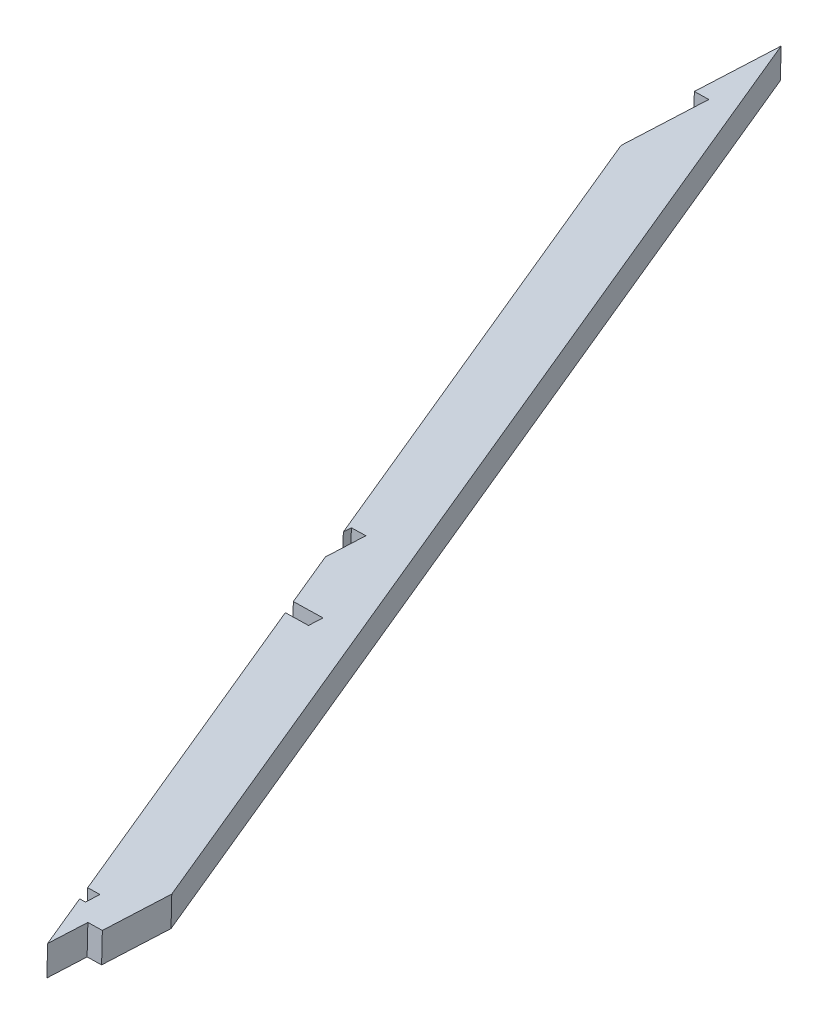
ISO-10303-21;
HEADER;
FILE_DESCRIPTION(('STEP AP214'),'2;1');
FILE_NAME('part.step','',(''),(''),'','','');
FILE_SCHEMA(('AUTOMOTIVE_DESIGN { 1 0 10303 214 1 1 1 1 }'));
ENDSEC;
DATA;
#1=APPLICATION_CONTEXT('core data for automotive mechanical design processes');
#2=APPLICATION_PROTOCOL_DEFINITION('international standard','automotive_design',2000,#1);
#3=PRODUCT_CONTEXT('',#1,'mechanical');
#4=PRODUCT('Part','Part','',(#3));
#5=PRODUCT_RELATED_PRODUCT_CATEGORY('part','',(#4));
#6=PRODUCT_DEFINITION_FORMATION('','',#4);
#7=PRODUCT_DEFINITION_CONTEXT('part definition',#1,'design');
#8=PRODUCT_DEFINITION('design','',#6,#7);
#9=PRODUCT_DEFINITION_SHAPE('','',#8);
#10=(LENGTH_UNIT() NAMED_UNIT(*) SI_UNIT(.MILLI.,.METRE.));
#11=(NAMED_UNIT(*) PLANE_ANGLE_UNIT() SI_UNIT($,.RADIAN.));
#12=(NAMED_UNIT(*) SI_UNIT($,.STERADIAN.) SOLID_ANGLE_UNIT());
#13=UNCERTAINTY_MEASURE_WITH_UNIT(LENGTH_MEASURE(1.E-05),#10,'distance_accuracy_value','');
#14=(GEOMETRIC_REPRESENTATION_CONTEXT(3) GLOBAL_UNCERTAINTY_ASSIGNED_CONTEXT((#13)) GLOBAL_UNIT_ASSIGNED_CONTEXT((#10,
#11,#12)) REPRESENTATION_CONTEXT('',''));
#15=CARTESIAN_POINT('',(0.,0.,0.));
#16=DIRECTION('',(0.,0.,1.));
#17=DIRECTION('',(1.,0.,0.));
#18=AXIS2_PLACEMENT_3D('',#15,#16,#17);
#19=CARTESIAN_POINT('',(364.27297918136,60.8553078660558,343.26140953432));
#20=DIRECTION('',(-0.913176215467708,1.17576176539816E-13,0.40756496353842));
#21=DIRECTION('',(-0.40756496353842,0.,-0.913176215467708));
#22=AXIS2_PLACEMENT_3D('',#19,#20,#21);
#23=PLANE('',#22);
#24=DIRECTION('',(-0.407036793898781,-0.0508935265530076,-0.911992816510964));
#25=VECTOR('',#24,1.);
#26=CARTESIAN_POINT('',(364.141264825195,67.1970788044048,342.966294821213));
#27=LINE('',#26,#25);
#28=CARTESIAN_POINT('',(364.141264825195,67.1970788044048,342.966294821213));
#29=VERTEX_POINT('',#28);
#30=CARTESIAN_POINT('',(329.209482269948,62.8294107467072,264.699329190999));
#31=VERTEX_POINT('',#30);
#32=EDGE_CURVE('E203',#29,#31,#27,.T.);
#33=ORIENTED_EDGE('',*,*,#32,.T.);
#34=DIRECTION('',(-0.0207424182938109,0.99870408477937,-0.0464747579695286));
#35=VECTOR('',#34,1.);
#36=CARTESIAN_POINT('',(329.341196626113,56.4876398083582,264.994443904106));
#37=LINE('',#36,#35);
#38=CARTESIAN_POINT('',(329.341196626113,56.4876398083582,264.994443904106));
#39=VERTEX_POINT('',#38);
#40=EDGE_CURVE('E38',#39,#31,#37,.T.);
#41=ORIENTED_EDGE('',*,*,#40,.F.);
#42=DIRECTION('',(-0.407036793898781,-0.0508935265530076,-0.911992816510964));
#43=VECTOR('',#42,1.);
#44=CARTESIAN_POINT('',(364.27297918136,60.8553078660558,343.26140953432));
#45=LINE('',#44,#43);
#46=CARTESIAN_POINT('',(364.27297918136,60.8553078660558,343.26140953432));
#47=VERTEX_POINT('',#46);
#48=EDGE_CURVE('E240',#47,#39,#45,.T.);
#49=ORIENTED_EDGE('',*,*,#48,.F.);
#50=DIRECTION('',(-0.0207424182938109,0.99870408477937,-0.0464747579695286));
#51=VECTOR('',#50,1.);
#52=CARTESIAN_POINT('',(364.27297918136,60.8553078660558,343.26140953432));
#53=LINE('',#52,#51);
#54=EDGE_CURVE('E11',#47,#29,#53,.T.);
#55=ORIENTED_EDGE('',*,*,#54,.T.);
#56=EDGE_LOOP('',(#33,#41,#49,#55));
#57=FACE_BOUND('',#56,.T.);
#58=ADVANCED_FACE('F35',(#57),#23,.T.);
#59=CARTESIAN_POINT('',(364.27297918136,60.8553078660558,343.26140953432));
#60=DIRECTION('',(-3.75435237648223E-05,0.0464839809289175,0.998919034810872));
#61=DIRECTION('',(0.,0.998919035514868,-0.0464839809616775));
#62=AXIS2_PLACEMENT_3D('',#59,#60,#61);
#63=PLANE('',#62);
#64=DIRECTION('',(-0.999784852192615,-0.0207217412878779,0.000926695305848225));
#65=VECTOR('',#64,1.);
#66=CARTESIAN_POINT('',(364.141264825195,67.1970788044048,342.966294821213));
#67=LINE('',#66,#65);
#68=CARTESIAN_POINT('',(366.826046244413,67.2527241223565,342.963806311477));
#69=VERTEX_POINT('',#68);
#70=EDGE_CURVE('E124',#69,#29,#67,.T.);
#71=ORIENTED_EDGE('',*,*,#70,.T.);
#72=ORIENTED_EDGE('',*,*,#54,.F.);
#73=DIRECTION('',(-0.999784852192615,-0.0207217412878779,0.000926695305848225));
#74=VECTOR('',#73,1.);
#75=CARTESIAN_POINT('',(364.27297918136,60.8553078660558,343.26140953432));
#76=LINE('',#75,#74);
#77=CARTESIAN_POINT('',(366.957760600579,60.9109531840075,343.258921024584));
#78=VERTEX_POINT('',#77);
#79=EDGE_CURVE('E53',#78,#47,#76,.T.);
#80=ORIENTED_EDGE('',*,*,#79,.F.);
#81=DIRECTION('',(-0.0207424182938109,0.99870408477937,-0.0464747579695286));
#82=VECTOR('',#81,1.);
#83=CARTESIAN_POINT('',(366.957760600579,60.9109531840075,343.258921024584));
#84=LINE('',#83,#82);
#85=EDGE_CURVE('E44',#78,#69,#84,.T.);
#86=ORIENTED_EDGE('',*,*,#85,.T.);
#87=EDGE_LOOP('',(#71,#72,#80,#86));
#88=FACE_BOUND('',#87,.T.);
#89=ADVANCED_FACE('F405',(#88),#63,.T.);
#90=CARTESIAN_POINT('',(366.957760600579,60.9109531840075,343.258921024584));
#91=DIRECTION('',(-0.999784852192615,-0.0207217412878786,0.000926695305820222));
#92=DIRECTION('',(0.020721750185429,-0.999785281482606,0.));
#93=AXIS2_PLACEMENT_3D('',#90,#91,#92);
#94=PLANE('',#93);
#95=DIRECTION('',(3.75435237928782E-05,-0.0464839809289197,-0.998919034810872));
#96=VECTOR('',#95,1.);
#97=CARTESIAN_POINT('',(366.826046244413,67.2527241223565,342.963806311477));
#98=LINE('',#97,#96);
#99=CARTESIAN_POINT('',(366.825927043725,67.4003107618058,346.135374247002));
#100=VERTEX_POINT('',#99);
#101=EDGE_CURVE('E118',#100,#69,#98,.T.);
#102=ORIENTED_EDGE('',*,*,#101,.T.);
#103=ORIENTED_EDGE('',*,*,#85,.F.);
#104=DIRECTION('',(3.75435237928782E-05,-0.0464839809289197,-0.998919034810872));
#105=VECTOR('',#104,1.);
#106=CARTESIAN_POINT('',(366.957760600579,60.9109531840075,343.258921024584));
#107=LINE('',#106,#105);
#108=CARTESIAN_POINT('',(366.957641399891,61.0585398234568,346.430488960108));
#109=VERTEX_POINT('',#108);
#110=EDGE_CURVE('E185',#109,#78,#107,.T.);
#111=ORIENTED_EDGE('',*,*,#110,.F.);
#112=DIRECTION('',(-0.0207424182938109,0.99870408477937,-0.0464747579695286));
#113=VECTOR('',#112,1.);
#114=CARTESIAN_POINT('',(366.957641399891,61.0585398234568,346.430488960108));
#115=LINE('',#114,#113);
#116=EDGE_CURVE('E192',#109,#100,#115,.T.);
#117=ORIENTED_EDGE('',*,*,#116,.T.);
#118=EDGE_LOOP('',(#102,#103,#111,#117));
#119=FACE_BOUND('',#118,.T.);
#120=ADVANCED_FACE('F198',(#119),#94,.T.);
#121=CARTESIAN_POINT('',(366.957641399891,61.0585398234568,346.430488960108));
#122=DIRECTION('',(3.75435238199837E-05,-0.0464839809289164,-0.998919034810872));
#123=DIRECTION('',(0.,-0.998919035514868,0.0464839809616764));
#124=AXIS2_PLACEMENT_3D('',#121,#122,#123);
#125=PLANE('',#124);
#126=DIRECTION('',(0.999784852192615,0.0207217412878924,-0.000926695305793668));
#127=VECTOR('',#126,1.);
#128=CARTESIAN_POINT('',(366.825927043725,67.4003107618058,346.135374247002));
#129=LINE('',#128,#127);
#130=CARTESIAN_POINT('',(365.556200281441,67.3739941503702,346.13655115004));
#131=VERTEX_POINT('',#130);
#132=EDGE_CURVE('E195',#131,#100,#129,.T.);
#133=ORIENTED_EDGE('',*,*,#132,.T.);
#134=ORIENTED_EDGE('',*,*,#116,.F.);
#135=DIRECTION('',(0.999784852192615,0.0207217412878924,-0.000926695305793668));
#136=VECTOR('',#135,1.);
#137=CARTESIAN_POINT('',(366.957641399891,61.0585398234568,346.430488960108));
#138=LINE('',#137,#136);
#139=CARTESIAN_POINT('',(365.687914637606,61.0322232120212,346.431665863147));
#140=VERTEX_POINT('',#139);
#141=EDGE_CURVE('E181',#140,#109,#138,.T.);
#142=ORIENTED_EDGE('',*,*,#141,.F.);
#143=DIRECTION('',(-0.0207424182938109,0.99870408477937,-0.0464747579695286));
#144=VECTOR('',#143,1.);
#145=CARTESIAN_POINT('',(365.687914637606,61.0322232120212,346.431665863147));
#146=LINE('',#145,#144);
#147=EDGE_CURVE('E196',#140,#131,#146,.T.);
#148=ORIENTED_EDGE('',*,*,#147,.T.);
#149=EDGE_LOOP('',(#133,#134,#142,#148));
#150=FACE_BOUND('',#149,.T.);
#151=ADVANCED_FACE('F193',(#150),#125,.T.);
#152=CARTESIAN_POINT('',(371.353078166241,61.7405624943501,359.124838863521));
#153=DIRECTION('',(-0.913176215467708,1.17616727408472E-13,0.407564963538421));
#154=DIRECTION('',(-0.407564963538421,0.,-0.913176215467708));
#155=AXIS2_PLACEMENT_3D('',#152,#153,#154);
#156=PLANE('',#155);
#157=DIRECTION('',(-0.407036793898781,-0.0508935265530086,-0.911992816510963));
#158=VECTOR('',#157,1.);
#159=CARTESIAN_POINT('',(371.221363810076,68.0823334326991,358.829724150414));
#160=LINE('',#159,#158);
#161=CARTESIAN_POINT('',(371.221363810076,68.0823334326991,358.829724150414));
#162=VERTEX_POINT('',#161);
#163=EDGE_CURVE('E236',#162,#131,#160,.T.);
#164=ORIENTED_EDGE('',*,*,#163,.T.);
#165=ORIENTED_EDGE('',*,*,#147,.F.);
#166=DIRECTION('',(-0.407036793898781,-0.0508935265530086,-0.911992816510963));
#167=VECTOR('',#166,1.);
#168=CARTESIAN_POINT('',(371.353078166241,61.7405624943501,359.124838863521));
#169=LINE('',#168,#167);
#170=CARTESIAN_POINT('',(371.353078166241,61.7405624943501,359.124838863521));
#171=VERTEX_POINT('',#170);
#172=EDGE_CURVE('E187',#171,#140,#169,.T.);
#173=ORIENTED_EDGE('',*,*,#172,.F.);
#174=DIRECTION('',(-0.0207424182938109,0.99870408477937,-0.0464747579695286));
#175=VECTOR('',#174,1.);
#176=CARTESIAN_POINT('',(371.353078166241,61.7405624943501,359.124838863521));
#177=LINE('',#176,#175);
#178=EDGE_CURVE('E244',#171,#162,#177,.T.);
#179=ORIENTED_EDGE('',*,*,#178,.T.);
#180=EDGE_LOOP('',(#164,#165,#173,#179));
#181=FACE_BOUND('',#180,.T.);
#182=ADVANCED_FACE('F344',(#181),#156,.T.);
#183=CARTESIAN_POINT('',(371.353078166241,61.7405624943501,359.124838863521));
#184=DIRECTION('',(0.999784852192615,0.020721741287877,-0.000926695305854155));
#185=DIRECTION('',(-0.0207217501854274,0.999785281482605,0.));
#186=AXIS2_PLACEMENT_3D('',#183,#184,#185);
#187=PLANE('',#186);
#188=DIRECTION('',(-3.75435237588767E-05,0.0464839809289185,0.998919034810872));
#189=VECTOR('',#188,1.);
#190=CARTESIAN_POINT('',(371.221363810076,68.0823334326991,358.829724150414));
#191=LINE('',#190,#189);
#192=CARTESIAN_POINT('',(371.221695348391,67.6718439738392,350.008497442844));
#193=VERTEX_POINT('',#192);
#194=EDGE_CURVE('E234',#193,#162,#191,.T.);
#195=ORIENTED_EDGE('',*,*,#194,.T.);
#196=ORIENTED_EDGE('',*,*,#178,.F.);
#197=DIRECTION('',(-3.75435237588767E-05,0.0464839809289185,0.998919034810872));
#198=VECTOR('',#197,1.);
#199=CARTESIAN_POINT('',(371.353078166241,61.7405624943501,359.124838863521));
#200=LINE('',#199,#198);
#201=CARTESIAN_POINT('',(371.353409704557,61.3300730354902,350.30361215595));
#202=VERTEX_POINT('',#201);
#203=EDGE_CURVE('E334',#202,#171,#200,.T.);
#204=ORIENTED_EDGE('',*,*,#203,.F.);
#205=DIRECTION('',(-0.0207424182938109,0.99870408477937,-0.0464747579695286));
#206=VECTOR('',#205,1.);
#207=CARTESIAN_POINT('',(371.353409704557,61.3300730354902,350.30361215595));
#208=LINE('',#207,#206);
#209=EDGE_CURVE('E247',#202,#193,#208,.T.);
#210=ORIENTED_EDGE('',*,*,#209,.T.);
#211=EDGE_LOOP('',(#195,#196,#204,#210));
#212=FACE_BOUND('',#211,.T.);
#213=ADVANCED_FACE('F340',(#212),#187,.T.);
#214=CARTESIAN_POINT('',(371.353409704557,61.3300730354902,350.30361215595));
#215=DIRECTION('',(-3.75435237669905E-05,0.0464839809289175,0.998919034810872));
#216=DIRECTION('',(0.,0.998919035514868,-0.0464839809616775));
#217=AXIS2_PLACEMENT_3D('',#214,#215,#216);
#218=PLANE('',#217);
#219=DIRECTION('',(-0.999784852192615,-0.0207217412878791,0.000926695305846111));
#220=VECTOR('',#219,1.);
#221=CARTESIAN_POINT('',(371.221695348391,67.6718439738392,350.008497442844));
#222=LINE('',#221,#220);
#223=CARTESIAN_POINT('',(374.396012254103,67.7376355024282,350.005555185248));
#224=VERTEX_POINT('',#223);
#225=EDGE_CURVE('E232',#224,#193,#222,.T.);
#226=ORIENTED_EDGE('',*,*,#225,.T.);
#227=ORIENTED_EDGE('',*,*,#209,.F.);
#228=DIRECTION('',(-0.999784852192615,-0.0207217412878791,0.000926695305846111));
#229=VECTOR('',#228,1.);
#230=CARTESIAN_POINT('',(371.353409704557,61.3300730354902,350.30361215595));
#231=LINE('',#230,#229);
#232=CARTESIAN_POINT('',(374.527726610269,61.3958645640792,350.300669898354));
#233=VERTEX_POINT('',#232);
#234=EDGE_CURVE('E332',#233,#202,#231,.T.);
#235=ORIENTED_EDGE('',*,*,#234,.F.);
#236=DIRECTION('',(-0.0207424182938109,0.99870408477937,-0.0464747579695286));
#237=VECTOR('',#236,1.);
#238=CARTESIAN_POINT('',(374.527726610269,61.3958645640792,350.300669898354));
#239=LINE('',#238,#237);
#240=EDGE_CURVE('E250',#233,#224,#239,.T.);
#241=ORIENTED_EDGE('',*,*,#240,.T.);
#242=EDGE_LOOP('',(#226,#227,#235,#241));
#243=FACE_BOUND('',#242,.T.);
#244=ADVANCED_FACE('F349',(#243),#218,.T.);
#245=CARTESIAN_POINT('',(374.527714356163,60.6874365819702,335.077144349531));
#246=DIRECTION('',(0.999784852897201,0.0207199583399856,-0.000965009694883335));
#247=DIRECTION('',(-0.0207199679876578,0.999785318419205,0.));
#248=AXIS2_PLACEMENT_3D('',#245,#246,#247);
#249=PLANE('',#248);
#250=DIRECTION('',(8.04075142126767E-07,0.0464847756947473,0.998918998531894));
#251=VECTOR('',#250,1.);
#252=CARTESIAN_POINT('',(374.395999999998,67.0292075203192,334.782029636425));
#253=LINE('',#252,#251);
#254=CARTESIAN_POINT('',(374.395999999998,67.0292075203192,334.782029636425));
#255=VERTEX_POINT('',#254);
#256=EDGE_CURVE('E230',#255,#224,#253,.T.);
#257=ORIENTED_EDGE('',*,*,#256,.T.);
#258=ORIENTED_EDGE('',*,*,#240,.F.);
#259=DIRECTION('',(8.04075142126767E-07,0.0464847756947473,0.998918998531894));
#260=VECTOR('',#259,1.);
#261=CARTESIAN_POINT('',(374.527714356163,60.6874365819702,335.077144349531));
#262=LINE('',#261,#260);
#263=CARTESIAN_POINT('',(374.527714356163,60.6874365819702,335.077144349531));
#264=VERTEX_POINT('',#263);
#265=EDGE_CURVE('E330',#264,#233,#262,.T.);
#266=ORIENTED_EDGE('',*,*,#265,.F.);
#267=DIRECTION('',(-0.0207424182938109,0.99870408477937,-0.0464747579695286));
#268=VECTOR('',#267,1.);
#269=CARTESIAN_POINT('',(374.527714356163,60.6874365819702,335.077144349531));
#270=LINE('',#269,#268);
#271=EDGE_CURVE('E253',#264,#255,#270,.T.);
#272=ORIENTED_EDGE('',*,*,#271,.T.);
#273=EDGE_LOOP('',(#257,#258,#266,#272));
#274=FACE_BOUND('',#273,.T.);
#275=ADVANCED_FACE('F353',(#274),#249,.T.);
#276=CARTESIAN_POINT('',(374.527714356163,60.6874365819702,335.077144349531));
#277=DIRECTION('',(0.913176215468969,0.,-0.407564963535595));
#278=DIRECTION('',(0.407564963535595,0.,0.913176215468969));
#279=AXIS2_PLACEMENT_3D('',#276,#277,#278);
#280=PLANE('',#279);
#281=DIRECTION('',(0.407036793895952,0.0508935265530076,0.911992816512226));
#282=VECTOR('',#281,1.);
#283=CARTESIAN_POINT('',(374.395999999998,67.0292075203192,334.782029636425));
#284=LINE('',#283,#282);
#285=CARTESIAN_POINT('',(266.700000000244,53.5635225556296,93.4820296369579));
#286=VERTEX_POINT('',#285);
#287=EDGE_CURVE('E228',#286,#255,#284,.T.);
#288=ORIENTED_EDGE('',*,*,#287,.T.);
#289=ORIENTED_EDGE('',*,*,#271,.F.);
#290=DIRECTION('',(0.407036793895952,0.0508935265530076,0.911992816512226));
#291=VECTOR('',#290,1.);
#292=CARTESIAN_POINT('',(374.527714356163,60.6874365819702,335.077144349531));
#293=LINE('',#292,#291);
#294=CARTESIAN_POINT('',(266.83171435641,47.2217516172806,93.7771443500644));
#295=VERTEX_POINT('',#294);
#296=EDGE_CURVE('E328',#295,#264,#293,.T.);
#297=ORIENTED_EDGE('',*,*,#296,.F.);
#298=DIRECTION('',(-0.0207424182938109,0.99870408477937,-0.0464747579695286));
#299=VECTOR('',#298,1.);
#300=CARTESIAN_POINT('',(266.83171435641,47.2217516172806,93.7771443500644));
#301=LINE('',#300,#299);
#302=EDGE_CURVE('E256',#295,#286,#301,.T.);
#303=ORIENTED_EDGE('',*,*,#302,.T.);
#304=EDGE_LOOP('',(#288,#289,#297,#303));
#305=FACE_BOUND('',#304,.T.);
#306=ADVANCED_FACE('F357',(#305),#280,.T.);
#307=CARTESIAN_POINT('',(266.831714356394,48.1072862768159,112.806551286876));
#308=DIRECTION('',(-0.999784852897524,-0.0207199957253124,0.000964206315296208));
#309=DIRECTION('',(0.0207200053569451,-0.999785317644747,0.));
#310=AXIS2_PLACEMENT_3D('',#307,#308,#309);
#311=PLANE('',#310);
#312=DIRECTION('',(8.07170020528009E-13,-0.0464847590307264,-0.998918999307679));
#313=VECTOR('',#312,1.);
#314=CARTESIAN_POINT('',(266.700000000228,54.4490572151649,112.511436573769));
#315=LINE('',#314,#313);
#316=CARTESIAN_POINT('',(266.700000000228,54.4490572151649,112.511436573769));
#317=VERTEX_POINT('',#316);
#318=EDGE_CURVE('E226',#317,#286,#315,.T.);
#319=ORIENTED_EDGE('',*,*,#318,.T.);
#320=ORIENTED_EDGE('',*,*,#302,.F.);
#321=DIRECTION('',(8.07170020528009E-13,-0.0464847590307264,-0.998918999307679));
#322=VECTOR('',#321,1.);
#323=CARTESIAN_POINT('',(266.831714356394,48.1072862768159,112.806551286876));
#324=LINE('',#323,#322);
#325=CARTESIAN_POINT('',(266.831714356394,48.1072862768159,112.806551286876));
#326=VERTEX_POINT('',#325);
#327=EDGE_CURVE('E326',#326,#295,#324,.T.);
#328=ORIENTED_EDGE('',*,*,#327,.F.);
#329=DIRECTION('',(-0.0207424182938109,0.99870408477937,-0.0464747579695286));
#330=VECTOR('',#329,1.);
#331=CARTESIAN_POINT('',(266.831714356394,48.1072862768159,112.806551286876));
#332=LINE('',#331,#330);
#333=EDGE_CURVE('E259',#326,#317,#332,.T.);
#334=ORIENTED_EDGE('',*,*,#333,.T.);
#335=EDGE_LOOP('',(#319,#320,#328,#334));
#336=FACE_BOUND('',#335,.T.);
#337=ADVANCED_FACE('F363',(#336),#311,.T.);
#338=CARTESIAN_POINT('',(270.006031264344,48.1730722632438,112.803489931824));
#339=DIRECTION('',(-8.14338409227392E-13,0.0464847590307265,0.998918999307679));
#340=DIRECTION('',(0.,0.998918999307679,-0.0464847590307265));
#341=AXIS2_PLACEMENT_3D('',#338,#339,#340);
#342=PLANE('',#341);
#343=DIRECTION('',(-0.999784852897524,-0.0207199957253131,0.000964206315289069));
#344=VECTOR('',#343,1.);
#345=CARTESIAN_POINT('',(269.874316908178,54.5148432015928,112.508375218718));
#346=LINE('',#345,#344);
#347=CARTESIAN_POINT('',(269.874316908178,54.5148432015928,112.508375218718));
#348=VERTEX_POINT('',#347);
#349=EDGE_CURVE('E224',#348,#317,#346,.T.);
#350=ORIENTED_EDGE('',*,*,#349,.T.);
#351=ORIENTED_EDGE('',*,*,#333,.F.);
#352=DIRECTION('',(-0.999784852897524,-0.0207199957253131,0.000964206315289069));
#353=VECTOR('',#352,1.);
#354=CARTESIAN_POINT('',(270.006031264344,48.1730722632438,112.803489931824));
#355=LINE('',#354,#353);
#356=CARTESIAN_POINT('',(270.006031264344,48.1730722632438,112.803489931824));
#357=VERTEX_POINT('',#356);
#358=EDGE_CURVE('E324',#357,#326,#355,.T.);
#359=ORIENTED_EDGE('',*,*,#358,.F.);
#360=DIRECTION('',(-0.0207424182938109,0.99870408477937,-0.0464747579695286));
#361=VECTOR('',#360,1.);
#362=CARTESIAN_POINT('',(270.006031264344,48.1730722632438,112.803489931824));
#363=LINE('',#362,#361);
#364=EDGE_CURVE('E262',#357,#348,#363,.T.);
#365=ORIENTED_EDGE('',*,*,#364,.T.);
#366=EDGE_LOOP('',(#350,#351,#359,#365));
#367=FACE_BOUND('',#366,.T.);
#368=ADVANCED_FACE('F368',(#367),#342,.T.);
#369=CARTESIAN_POINT('',(270.006031264328,49.0687139050207,132.050087552147));
#370=DIRECTION('',(-0.999784852897524,-0.0207199957253125,0.000964206315293799));
#371=DIRECTION('',(0.0207200053569452,-0.999785317644747,0.));
#372=AXIS2_PLACEMENT_3D('',#369,#370,#371);
#373=PLANE('',#372);
#374=DIRECTION('',(8.09585760026587E-13,-0.0464847590307266,-0.998918999307679));
#375=VECTOR('',#374,1.);
#376=CARTESIAN_POINT('',(269.874316908162,55.4104848433697,131.754972839041));
#377=LINE('',#376,#375);
#378=CARTESIAN_POINT('',(269.874316908162,55.4104848433697,131.754972839041));
#379=VERTEX_POINT('',#378);
#380=EDGE_CURVE('E222',#379,#348,#377,.T.);
#381=ORIENTED_EDGE('',*,*,#380,.T.);
#382=ORIENTED_EDGE('',*,*,#364,.F.);
#383=DIRECTION('',(8.09585760026587E-13,-0.0464847590307266,-0.998918999307679));
#384=VECTOR('',#383,1.);
#385=CARTESIAN_POINT('',(270.006031264328,49.0687139050207,132.050087552147));
#386=LINE('',#385,#384);
#387=CARTESIAN_POINT('',(270.006031264328,49.0687139050207,132.050087552147));
#388=VERTEX_POINT('',#387);
#389=EDGE_CURVE('E322',#388,#357,#386,.T.);
#390=ORIENTED_EDGE('',*,*,#389,.F.);
#391=DIRECTION('',(-0.0207424182938109,0.99870408477937,-0.0464747579695286));
#392=VECTOR('',#391,1.);
#393=CARTESIAN_POINT('',(270.006031264328,49.0687139050207,132.050087552147));
#394=LINE('',#393,#392);
#395=EDGE_CURVE('E265',#388,#379,#394,.T.);
#396=ORIENTED_EDGE('',*,*,#395,.T.);
#397=EDGE_LOOP('',(#381,#382,#390,#396));
#398=FACE_BOUND('',#397,.T.);
#399=ADVANCED_FACE('F372',(#398),#373,.T.);
#400=CARTESIAN_POINT('',(319.092469835739,55.2061982854817,242.03149472775));
#401=DIRECTION('',(-0.913176215467708,1.17591116333531E-13,0.40756496353842));
#402=DIRECTION('',(-0.40756496353842,0.,-0.913176215467708));
#403=AXIS2_PLACEMENT_3D('',#400,#401,#402);
#404=PLANE('',#403);
#405=DIRECTION('',(-0.407036793898781,-0.0508935265530076,-0.911992816510963));
#406=VECTOR('',#405,1.);
#407=CARTESIAN_POINT('',(318.960755479574,61.5479692238307,241.736380014644));
#408=LINE('',#407,#406);
#409=CARTESIAN_POINT('',(318.960755479574,61.5479692238307,241.736380014644));
#410=VERTEX_POINT('',#409);
#411=EDGE_CURVE('E220',#410,#379,#408,.T.);
#412=ORIENTED_EDGE('',*,*,#411,.T.);
#413=ORIENTED_EDGE('',*,*,#395,.F.);
#414=DIRECTION('',(-0.407036793898781,-0.0508935265530076,-0.911992816510963));
#415=VECTOR('',#414,1.);
#416=CARTESIAN_POINT('',(319.092469835739,55.2061982854817,242.03149472775));
#417=LINE('',#416,#415);
#418=CARTESIAN_POINT('',(319.092469835739,55.2061982854817,242.03149472775));
#419=VERTEX_POINT('',#418);
#420=EDGE_CURVE('E320',#419,#388,#417,.T.);
#421=ORIENTED_EDGE('',*,*,#420,.F.);
#422=DIRECTION('',(-0.0207424182938109,0.99870408477937,-0.0464747579695286));
#423=VECTOR('',#422,1.);
#424=CARTESIAN_POINT('',(319.092469835739,55.2061982854817,242.03149472775));
#425=LINE('',#424,#423);
#426=EDGE_CURVE('E268',#419,#410,#425,.T.);
#427=ORIENTED_EDGE('',*,*,#426,.T.);
#428=EDGE_LOOP('',(#412,#413,#421,#427));
#429=FACE_BOUND('',#428,.T.);
#430=ADVANCED_FACE('F378',(#429),#404,.T.);
#431=CARTESIAN_POINT('',(319.092536201098,55.124028959484,240.265714298098));
#432=DIRECTION('',(0.999784852192615,0.0207217412878769,-0.000926695305855354));
#433=DIRECTION('',(-0.0207217501854274,0.999785281482605,0.));
#434=AXIS2_PLACEMENT_3D('',#431,#432,#433);
#435=PLANE('',#434);
#436=DIRECTION('',(-3.75435237576673E-05,0.046483980928918,0.998919034810872));
#437=VECTOR('',#436,1.);
#438=CARTESIAN_POINT('',(318.960821844932,61.465799897833,239.970599584991));
#439=LINE('',#438,#437);
#440=CARTESIAN_POINT('',(318.960821844932,61.465799897833,239.970599584991));
#441=VERTEX_POINT('',#440);
#442=EDGE_CURVE('E218',#441,#410,#439,.T.);
#443=ORIENTED_EDGE('',*,*,#442,.T.);
#444=ORIENTED_EDGE('',*,*,#426,.F.);
#445=DIRECTION('',(-3.75435237576673E-05,0.046483980928918,0.998919034810872));
#446=VECTOR('',#445,1.);
#447=CARTESIAN_POINT('',(319.092536201098,55.124028959484,240.265714298098));
#448=LINE('',#447,#446);
#449=CARTESIAN_POINT('',(319.092536201098,55.124028959484,240.265714298098));
#450=VERTEX_POINT('',#449);
#451=EDGE_CURVE('E318',#450,#419,#448,.T.);
#452=ORIENTED_EDGE('',*,*,#451,.F.);
#453=DIRECTION('',(-0.0207424182938109,0.99870408477937,-0.0464747579695286));
#454=VECTOR('',#453,1.);
#455=CARTESIAN_POINT('',(319.092536201098,55.124028959484,240.265714298098));
#456=LINE('',#455,#454);
#457=EDGE_CURVE('E271',#450,#441,#456,.T.);
#458=ORIENTED_EDGE('',*,*,#457,.T.);
#459=EDGE_LOOP('',(#443,#444,#452,#458));
#460=FACE_BOUND('',#459,.T.);
#461=ADVANCED_FACE('F383',(#460),#435,.T.);
#462=CARTESIAN_POINT('',(322.266853106809,55.1898204880731,240.262772040502));
#463=DIRECTION('',(-3.754352375826E-05,0.0464839809289177,0.998919034810872));
#464=DIRECTION('',(0.,0.998919035514868,-0.0464839809616776));
#465=AXIS2_PLACEMENT_3D('',#462,#463,#464);
#466=PLANE('',#465);
#467=DIRECTION('',(-0.999784852192615,-0.0207217412878791,0.000926695305854853));
#468=VECTOR('',#467,1.);
#469=CARTESIAN_POINT('',(322.135138750643,61.5315914264221,239.967657327395));
#470=LINE('',#469,#468);
#471=CARTESIAN_POINT('',(322.135138750643,61.5315914264221,239.967657327395));
#472=VERTEX_POINT('',#471);
#473=EDGE_CURVE('E216',#472,#441,#470,.T.);
#474=ORIENTED_EDGE('',*,*,#473,.T.);
#475=ORIENTED_EDGE('',*,*,#457,.F.);
#476=DIRECTION('',(-0.999784852192615,-0.0207217412878791,0.000926695305854853));
#477=VECTOR('',#476,1.);
#478=CARTESIAN_POINT('',(322.266853106809,55.1898204880731,240.262772040502));
#479=LINE('',#478,#477);
#480=CARTESIAN_POINT('',(322.266853106809,55.1898204880731,240.262772040502));
#481=VERTEX_POINT('',#480);
#482=EDGE_CURVE('E316',#481,#450,#479,.T.);
#483=ORIENTED_EDGE('',*,*,#482,.F.);
#484=DIRECTION('',(-0.0207424182938109,0.99870408477937,-0.0464747579695286));
#485=VECTOR('',#484,1.);
#486=CARTESIAN_POINT('',(322.266853106809,55.1898204880731,240.262772040502));
#487=LINE('',#486,#485);
#488=EDGE_CURVE('E274',#481,#472,#487,.T.);
#489=ORIENTED_EDGE('',*,*,#488,.T.);
#490=EDGE_LOOP('',(#474,#475,#483,#489));
#491=FACE_BOUND('',#490,.T.);
#492=ADVANCED_FACE('F387',(#491),#466,.T.);
#493=CARTESIAN_POINT('',(322.266519344883,55.6030630785311,249.14316225997));
#494=DIRECTION('',(-0.999784852192615,-0.0207217412878769,0.000926695305855096));
#495=DIRECTION('',(0.0207217501854274,-0.999785281482605,0.));
#496=AXIS2_PLACEMENT_3D('',#493,#494,#495);
#497=PLANE('',#496);
#498=DIRECTION('',(3.75435237579103E-05,-0.0464839809289173,-0.998919034810872));
#499=VECTOR('',#498,1.);
#500=CARTESIAN_POINT('',(322.134804988717,61.9448340168801,248.848047546864));
#501=LINE('',#500,#499);
#502=CARTESIAN_POINT('',(322.134804988717,61.9448340168801,248.848047546864));
#503=VERTEX_POINT('',#502);
#504=EDGE_CURVE('E214',#503,#472,#501,.T.);
#505=ORIENTED_EDGE('',*,*,#504,.T.);
#506=ORIENTED_EDGE('',*,*,#488,.F.);
#507=DIRECTION('',(3.75435237579103E-05,-0.0464839809289173,-0.998919034810872));
#508=VECTOR('',#507,1.);
#509=CARTESIAN_POINT('',(322.266519344883,55.6030630785311,249.14316225997));
#510=LINE('',#509,#508);
#511=CARTESIAN_POINT('',(322.266519344883,55.6030630785311,249.14316225997));
#512=VERTEX_POINT('',#511);
#513=EDGE_CURVE('E310',#512,#481,#510,.T.);
#514=ORIENTED_EDGE('',*,*,#513,.F.);
#515=DIRECTION('',(-0.0207424182938109,0.99870408477937,-0.0464747579695286));
#516=VECTOR('',#515,1.);
#517=CARTESIAN_POINT('',(322.266519344883,55.6030630785311,249.14316225997));
#518=LINE('',#517,#516);
#519=EDGE_CURVE('E277',#512,#503,#518,.T.);
#520=ORIENTED_EDGE('',*,*,#519,.T.);
#521=EDGE_LOOP('',(#505,#506,#514,#520));
#522=FACE_BOUND('',#521,.T.);
#523=ADVANCED_FACE('F391',(#522),#497,.T.);
#524=CARTESIAN_POINT('',(327.926261169867,56.3107244623928,261.824187575279));
#525=DIRECTION('',(-0.913176215467711,1.17228292771873E-13,0.407564963538414));
#526=DIRECTION('',(-0.407564963538414,0.,-0.913176215467711));
#527=AXIS2_PLACEMENT_3D('',#524,#525,#526);
#528=PLANE('',#527);
#529=DIRECTION('',(-0.407036793898774,-0.0508935265530077,-0.911992816510966));
#530=VECTOR('',#529,1.);
#531=CARTESIAN_POINT('',(327.794546813701,62.6524954007418,261.529072862172));
#532=LINE('',#531,#530);
#533=CARTESIAN_POINT('',(327.794546813701,62.6524954007418,261.529072862172));
#534=VERTEX_POINT('',#533);
#535=EDGE_CURVE('E212',#534,#503,#532,.T.);
#536=ORIENTED_EDGE('',*,*,#535,.T.);
#537=ORIENTED_EDGE('',*,*,#519,.F.);
#538=DIRECTION('',(-0.407036793898774,-0.0508935265530077,-0.911992816510966));
#539=VECTOR('',#538,1.);
#540=CARTESIAN_POINT('',(327.926261169867,56.3107244623928,261.824187575279));
#541=LINE('',#540,#539);
#542=CARTESIAN_POINT('',(327.926261169867,56.3107244623928,261.824187575279));
#543=VERTEX_POINT('',#542);
#544=EDGE_CURVE('E307',#543,#512,#541,.T.);
#545=ORIENTED_EDGE('',*,*,#544,.F.);
#546=DIRECTION('',(-0.0207424182938109,0.99870408477937,-0.0464747579695286));
#547=VECTOR('',#546,1.);
#548=CARTESIAN_POINT('',(327.926261169867,56.3107244623928,261.824187575279));
#549=LINE('',#548,#547);
#550=EDGE_CURVE('E280',#543,#534,#549,.T.);
#551=ORIENTED_EDGE('',*,*,#550,.T.);
#552=EDGE_LOOP('',(#536,#537,#545,#551));
#553=FACE_BOUND('',#552,.T.);
#554=ADVANCED_FACE('F395',(#553),#528,.T.);
#555=CARTESIAN_POINT('',(327.926261169867,56.3107244623928,261.824187575279));
#556=DIRECTION('',(-3.75435237711745E-05,0.0464839809289174,0.998919034810872));
#557=DIRECTION('',(0.,0.998919035514868,-0.0464839809616774));
#558=AXIS2_PLACEMENT_3D('',#555,#556,#557);
#559=PLANE('',#558);
#560=DIRECTION('',(-0.999784852192615,-0.0207217412878771,0.00092669530584183));
#561=VECTOR('',#560,1.);
#562=CARTESIAN_POINT('',(327.794546813701,62.6524954007418,261.529072862172));
#563=LINE('',#562,#561);
#564=CARTESIAN_POINT('',(334.288508519774,62.7870905530003,261.523053643321));
#565=VERTEX_POINT('',#564);
#566=EDGE_CURVE('E210',#565,#534,#563,.T.);
#567=ORIENTED_EDGE('',*,*,#566,.T.);
#568=ORIENTED_EDGE('',*,*,#550,.F.);
#569=DIRECTION('',(-0.999784852192615,-0.0207217412878771,0.00092669530584183));
#570=VECTOR('',#569,1.);
#571=CARTESIAN_POINT('',(327.926261169867,56.3107244623928,261.824187575279));
#572=LINE('',#571,#570);
#573=CARTESIAN_POINT('',(334.42022287594,56.4453196146513,261.818168356428));
#574=VERTEX_POINT('',#573);
#575=EDGE_CURVE('E305',#574,#543,#572,.T.);
#576=ORIENTED_EDGE('',*,*,#575,.F.);
#577=DIRECTION('',(-0.0207424182938109,0.99870408477937,-0.0464747579695286));
#578=VECTOR('',#577,1.);
#579=CARTESIAN_POINT('',(334.42022287594,56.4453196146513,261.818168356428));
#580=LINE('',#579,#578);
#581=EDGE_CURVE('E283',#574,#565,#580,.T.);
#582=ORIENTED_EDGE('',*,*,#581,.T.);
#583=EDGE_LOOP('',(#567,#568,#576,#582));
#584=FACE_BOUND('',#583,.T.);
#585=ADVANCED_FACE('F303',(#584),#559,.T.);
#586=CARTESIAN_POINT('',(334.42022287594,56.4453196146513,261.818168356428));
#587=DIRECTION('',(-0.999784852192615,-0.0207217412878786,0.000926695305820132));
#588=DIRECTION('',(0.020721750185429,-0.999785281482605,0.));
#589=AXIS2_PLACEMENT_3D('',#586,#587,#588);
#590=PLANE('',#589);
#591=DIRECTION('',(3.75435237928782E-05,-0.0464839809289153,-0.998919034810872));
#592=VECTOR('',#591,1.);
#593=CARTESIAN_POINT('',(334.288508519774,62.7870905530003,261.523053643321));
#594=LINE('',#593,#592);
#595=CARTESIAN_POINT('',(334.288389319086,62.9346771924496,264.694621578846));
#596=VERTEX_POINT('',#595);
#597=EDGE_CURVE('E208',#596,#565,#594,.T.);
#598=ORIENTED_EDGE('',*,*,#597,.T.);
#599=ORIENTED_EDGE('',*,*,#581,.F.);
#600=DIRECTION('',(3.75435237928782E-05,-0.0464839809289153,-0.998919034810872));
#601=VECTOR('',#600,1.);
#602=CARTESIAN_POINT('',(334.42022287594,56.4453196146513,261.818168356428));
#603=LINE('',#602,#601);
#604=CARTESIAN_POINT('',(334.420103675252,56.5929062541006,264.989736291952));
#605=VERTEX_POINT('',#604);
#606=EDGE_CURVE('E308',#605,#574,#603,.T.);
#607=ORIENTED_EDGE('',*,*,#606,.F.);
#608=DIRECTION('',(-0.0207424182938109,0.99870408477937,-0.0464747579695286));
#609=VECTOR('',#608,1.);
#610=CARTESIAN_POINT('',(334.420103675252,56.5929062541006,264.989736291952));
#611=LINE('',#610,#609);
#612=EDGE_CURVE('E285',#605,#596,#611,.T.);
#613=ORIENTED_EDGE('',*,*,#612,.T.);
#614=EDGE_LOOP('',(#598,#599,#607,#613));
#615=FACE_BOUND('',#614,.T.);
#616=ADVANCED_FACE('F300',(#615),#590,.T.);
#617=CARTESIAN_POINT('',(334.420103675252,56.5929062541006,264.989736291952));
#618=DIRECTION('',(3.75435237537423E-05,-0.0464839809289178,-0.998919034810872));
#619=DIRECTION('',(0.,-0.998919035514868,0.0464839809616777));
#620=AXIS2_PLACEMENT_3D('',#617,#618,#619);
#621=PLANE('',#620);
#622=DIRECTION('',(0.999784852192615,0.0207217412878758,-0.000926695305859222));
#623=VECTOR('',#622,1.);
#624=CARTESIAN_POINT('',(334.288389319086,62.9346771924496,264.694621578846));
#625=LINE('',#624,#623);
#626=EDGE_CURVE('E206',#31,#596,#625,.T.);
#627=ORIENTED_EDGE('',*,*,#626,.T.);
#628=ORIENTED_EDGE('',*,*,#612,.F.);
#629=DIRECTION('',(0.999784852192615,0.0207217412878758,-0.000926695305859222));
#630=VECTOR('',#629,1.);
#631=CARTESIAN_POINT('',(334.420103675252,56.5929062541006,264.989736291952));
#632=LINE('',#631,#630);
#633=EDGE_CURVE('E132',#39,#605,#632,.T.);
#634=ORIENTED_EDGE('',*,*,#633,.F.);
#635=ORIENTED_EDGE('',*,*,#40,.T.);
#636=EDGE_LOOP('',(#627,#628,#634,#635));
#637=FACE_BOUND('',#636,.T.);
#638=ADVANCED_FACE('F291',(#637),#621,.T.);
#639=CARTESIAN_POINT('',(-0.773019133922822,37.2192555239168,-1.73200041798387));
#640=DIRECTION('',(0.0207424182938113,-0.99870408477937,0.0464747579695284));
#641=DIRECTION('',(0.,0.0464847590307432,0.998918999307678));
#642=AXIS2_PLACEMENT_3D('',#639,#640,#641);
#643=PLANE('',#642);
#644=ORIENTED_EDGE('',*,*,#48,.T.);
#645=ORIENTED_EDGE('',*,*,#633,.T.);
#646=ORIENTED_EDGE('',*,*,#606,.T.);
#647=ORIENTED_EDGE('',*,*,#575,.T.);
#648=ORIENTED_EDGE('',*,*,#544,.T.);
#649=ORIENTED_EDGE('',*,*,#513,.T.);
#650=ORIENTED_EDGE('',*,*,#482,.T.);
#651=ORIENTED_EDGE('',*,*,#451,.T.);
#652=ORIENTED_EDGE('',*,*,#420,.T.);
#653=ORIENTED_EDGE('',*,*,#389,.T.);
#654=ORIENTED_EDGE('',*,*,#358,.T.);
#655=ORIENTED_EDGE('',*,*,#327,.T.);
#656=ORIENTED_EDGE('',*,*,#296,.T.);
#657=ORIENTED_EDGE('',*,*,#265,.T.);
#658=ORIENTED_EDGE('',*,*,#234,.T.);
#659=ORIENTED_EDGE('',*,*,#203,.T.);
#660=ORIENTED_EDGE('',*,*,#172,.T.);
#661=ORIENTED_EDGE('',*,*,#141,.T.);
#662=ORIENTED_EDGE('',*,*,#110,.T.);
#663=ORIENTED_EDGE('',*,*,#79,.T.);
#664=EDGE_LOOP('',(#644,#645,#646,#647,#648,#649,#650,#651,#652,#653,#654,#655,#656,#657,#658,
#659,#660,#661,#662,#663));
#665=FACE_BOUND('',#664,.T.);
#666=ADVANCED_FACE('F183',(#665),#643,.T.);
#667=CARTESIAN_POINT('',(-0.904733490088521,43.5610264622658,-2.02711513109038));
#668=DIRECTION('',(0.0207424182938113,-0.99870408477937,0.0464747579695284));
#669=DIRECTION('',(0.,0.0464847590307432,0.998918999307678));
#670=AXIS2_PLACEMENT_3D('',#667,#668,#669);
#671=PLANE('',#670);
#672=ORIENTED_EDGE('',*,*,#32,.F.);
#673=ORIENTED_EDGE('',*,*,#70,.F.);
#674=ORIENTED_EDGE('',*,*,#101,.F.);
#675=ORIENTED_EDGE('',*,*,#132,.F.);
#676=ORIENTED_EDGE('',*,*,#163,.F.);
#677=ORIENTED_EDGE('',*,*,#194,.F.);
#678=ORIENTED_EDGE('',*,*,#225,.F.);
#679=ORIENTED_EDGE('',*,*,#256,.F.);
#680=ORIENTED_EDGE('',*,*,#287,.F.);
#681=ORIENTED_EDGE('',*,*,#318,.F.);
#682=ORIENTED_EDGE('',*,*,#349,.F.);
#683=ORIENTED_EDGE('',*,*,#380,.F.);
#684=ORIENTED_EDGE('',*,*,#411,.F.);
#685=ORIENTED_EDGE('',*,*,#442,.F.);
#686=ORIENTED_EDGE('',*,*,#473,.F.);
#687=ORIENTED_EDGE('',*,*,#504,.F.);
#688=ORIENTED_EDGE('',*,*,#535,.F.);
#689=ORIENTED_EDGE('',*,*,#566,.F.);
#690=ORIENTED_EDGE('',*,*,#597,.F.);
#691=ORIENTED_EDGE('',*,*,#626,.F.);
#692=EDGE_LOOP('',(#672,#673,#674,#675,#676,#677,#678,#679,#680,#681,#682,#683,#684,#685,#686,
#687,#688,#689,#690,#691));
#693=FACE_BOUND('',#692,.T.);
#694=ADVANCED_FACE('F296',(#693),#671,.F.);
#695=CLOSED_SHELL('',(#58,#89,#120,#151,#182,#213,#244,#275,#306,#337,#368,#399,#430,#461,#492,
#523,#554,#585,#616,#638,#666,#694));
#696=MANIFOLD_SOLID_BREP('B2',#695);
#697=ADVANCED_BREP_SHAPE_REPRESENTATION('',(#18,#696),#14);
#698=SHAPE_DEFINITION_REPRESENTATION(#9,#697);
ENDSEC;
END-ISO-10303-21;
